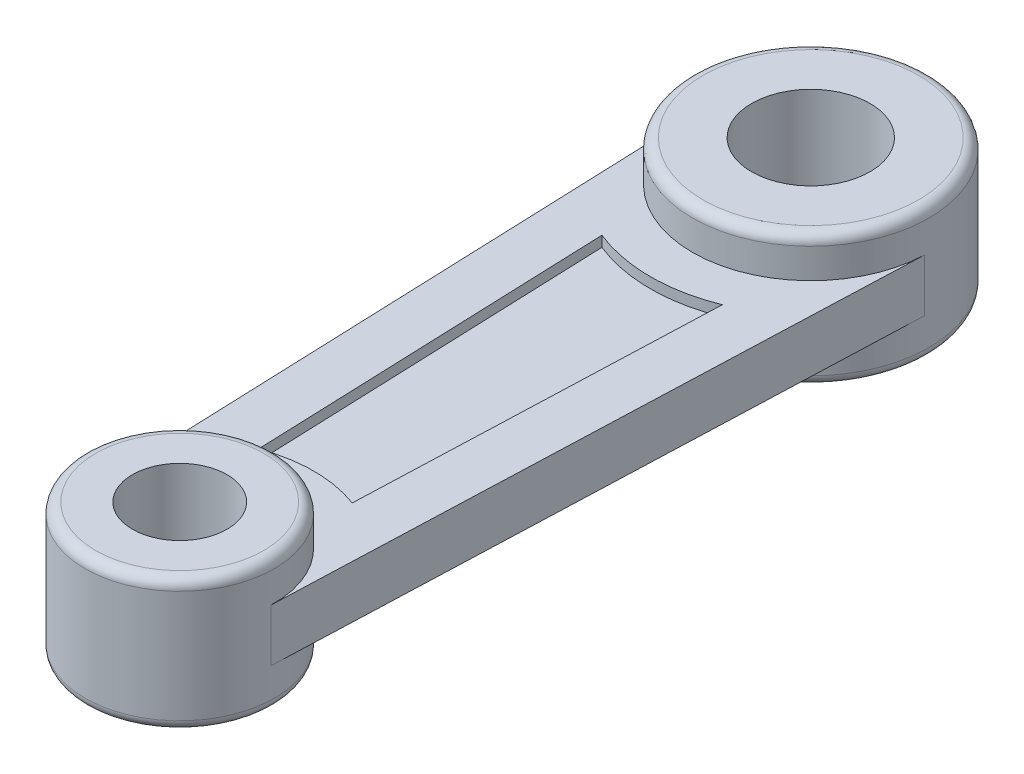
ISO-10303-21;
HEADER;
FILE_DESCRIPTION(('STEP AP214'),'2;1');
FILE_NAME('part.step','',(''),(''),'','','');
FILE_SCHEMA(('AUTOMOTIVE_DESIGN { 1 0 10303 214 1 1 1 1 }'));
ENDSEC;
DATA;
#1=APPLICATION_CONTEXT('core data for automotive mechanical design processes');
#2=APPLICATION_PROTOCOL_DEFINITION('international standard','automotive_design',2000,#1);
#3=PRODUCT_CONTEXT('',#1,'mechanical');
#4=PRODUCT('Part','Part','',(#3));
#5=PRODUCT_RELATED_PRODUCT_CATEGORY('part','',(#4));
#6=PRODUCT_DEFINITION_FORMATION('','',#4);
#7=PRODUCT_DEFINITION_CONTEXT('part definition',#1,'design');
#8=PRODUCT_DEFINITION('design','',#6,#7);
#9=PRODUCT_DEFINITION_SHAPE('','',#8);
#10=(LENGTH_UNIT() NAMED_UNIT(*) SI_UNIT(.MILLI.,.METRE.));
#11=(NAMED_UNIT(*) PLANE_ANGLE_UNIT() SI_UNIT($,.RADIAN.));
#12=(NAMED_UNIT(*) SI_UNIT($,.STERADIAN.) SOLID_ANGLE_UNIT());
#13=UNCERTAINTY_MEASURE_WITH_UNIT(LENGTH_MEASURE(1.E-05),#10,'distance_accuracy_value','');
#14=(GEOMETRIC_REPRESENTATION_CONTEXT(3) GLOBAL_UNCERTAINTY_ASSIGNED_CONTEXT((#13)) GLOBAL_UNIT_ASSIGNED_CONTEXT((#10,
#11,#12)) REPRESENTATION_CONTEXT('',''));
#15=CARTESIAN_POINT('',(0.,0.,0.));
#16=DIRECTION('',(0.,0.,1.));
#17=DIRECTION('',(1.,0.,0.));
#18=AXIS2_PLACEMENT_3D('',#15,#16,#17);
#19=CARTESIAN_POINT('',(0.,31.65,0.));
#20=DIRECTION('',(0.,1.,0.));
#21=DIRECTION('',(0.,0.,1.));
#22=AXIS2_PLACEMENT_3D('',#19,#20,#21);
#23=PLANE('',#22);
#24=CARTESIAN_POINT('',(0.,31.65,0.));
#25=DIRECTION('',(0.,1.,0.));
#26=DIRECTION('',(0.,0.,1.));
#27=AXIS2_PLACEMENT_3D('',#24,#25,#26);
#28=CIRCLE('',#27,40.);
#29=CARTESIAN_POINT('',(0.,31.65,40.));
#30=VERTEX_POINT('',#29);
#31=EDGE_CURVE('E11',#30,#30,#28,.T.);
#32=ORIENTED_EDGE('',*,*,#31,.T.);
#33=EDGE_LOOP('',(#32));
#34=FACE_BOUND('',#33,.T.);
#35=CARTESIAN_POINT('',(0.,31.65,0.));
#36=DIRECTION('',(0.,1.,0.));
#37=DIRECTION('',(0.,0.,1.));
#38=AXIS2_PLACEMENT_3D('',#35,#36,#37);
#39=CIRCLE('',#38,22.5);
#40=CARTESIAN_POINT('',(0.,31.65,22.5));
#41=VERTEX_POINT('',#40);
#42=EDGE_CURVE('E279',#41,#41,#39,.T.);
#43=ORIENTED_EDGE('',*,*,#42,.F.);
#44=EDGE_LOOP('',(#43));
#45=FACE_BOUND('',#44,.T.);
#46=ADVANCED_FACE('F45',(#34,#45),#23,.T.);
#47=CARTESIAN_POINT('',(0.,-31.65,0.));
#48=DIRECTION('',(0.,1.,0.));
#49=DIRECTION('',(0.,0.,1.));
#50=AXIS2_PLACEMENT_3D('',#47,#48,#49);
#51=PLANE('',#50);
#52=CARTESIAN_POINT('',(0.,-31.65,0.));
#53=DIRECTION('',(0.,1.,0.));
#54=DIRECTION('',(0.,0.,1.));
#55=AXIS2_PLACEMENT_3D('',#52,#53,#54);
#56=CIRCLE('',#55,40.);
#57=CARTESIAN_POINT('',(0.,-31.65,40.));
#58=VERTEX_POINT('',#57);
#59=EDGE_CURVE('E54',#58,#58,#56,.F.);
#60=ORIENTED_EDGE('',*,*,#59,.T.);
#61=EDGE_LOOP('',(#60));
#62=FACE_BOUND('',#61,.T.);
#63=CARTESIAN_POINT('',(0.,-31.65,0.));
#64=DIRECTION('',(0.,1.,0.));
#65=DIRECTION('',(0.,0.,1.));
#66=AXIS2_PLACEMENT_3D('',#63,#64,#65);
#67=CIRCLE('',#66,22.5);
#68=CARTESIAN_POINT('',(0.,-31.65,22.5));
#69=VERTEX_POINT('',#68);
#70=EDGE_CURVE('E278',#69,#69,#67,.T.);
#71=ORIENTED_EDGE('',*,*,#70,.T.);
#72=EDGE_LOOP('',(#71));
#73=FACE_BOUND('',#72,.T.);
#74=ADVANCED_FACE('F313',(#62,#73),#51,.F.);
#75=CARTESIAN_POINT('',(0.,31.65,0.));
#76=DIRECTION('',(0.,-1.,0.));
#77=DIRECTION('',(0.,0.,-1.));
#78=AXIS2_PLACEMENT_3D('',#75,#76,#77);
#79=CYLINDRICAL_SURFACE('',#78,45.);
#80=CARTESIAN_POINT('',(0.,-26.65,0.));
#81=DIRECTION('',(0.,1.,0.));
#82=DIRECTION('',(0.,0.,1.));
#83=AXIS2_PLACEMENT_3D('',#80,#81,#82);
#84=CIRCLE('',#83,45.);
#85=CARTESIAN_POINT('',(0.,-26.65,45.));
#86=VERTEX_POINT('',#85);
#87=EDGE_CURVE('E306',#86,#86,#84,.T.);
#88=ORIENTED_EDGE('',*,*,#87,.T.);
#89=EDGE_LOOP('',(#88));
#90=FACE_BOUND('',#89,.T.);
#91=CARTESIAN_POINT('',(0.,26.65,0.));
#92=DIRECTION('',(0.,1.,0.));
#93=DIRECTION('',(0.,0.,1.));
#94=AXIS2_PLACEMENT_3D('',#91,#92,#93);
#95=CIRCLE('',#94,45.);
#96=CARTESIAN_POINT('',(0.,26.65,45.));
#97=VERTEX_POINT('',#96);
#98=EDGE_CURVE('E302',#97,#97,#95,.F.);
#99=ORIENTED_EDGE('',*,*,#98,.T.);
#100=EDGE_LOOP('',(#99));
#101=FACE_BOUND('',#100,.T.);
#102=DIRECTION('',(0.,-1.,0.));
#103=VECTOR('',#102,1.);
#104=CARTESIAN_POINT('',(44.9683482435146,12.5,1.6875));
#105=LINE('',#104,#103);
#106=CARTESIAN_POINT('',(44.9683482435146,12.5,1.6875));
#107=VERTEX_POINT('',#106);
#108=CARTESIAN_POINT('',(44.9683482435146,-12.5,1.6875));
#109=VERTEX_POINT('',#108);
#110=EDGE_CURVE('E274',#107,#109,#105,.T.);
#111=ORIENTED_EDGE('',*,*,#110,.F.);
#112=CARTESIAN_POINT('',(0.,12.5,0.));
#113=DIRECTION('',(0.,-1.,0.));
#114=DIRECTION('',(0.,0.,1.));
#115=AXIS2_PLACEMENT_3D('',#112,#113,#114);
#116=CIRCLE('',#115,45.);
#117=CARTESIAN_POINT('',(-44.9683482435146,12.5,1.6875));
#118=VERTEX_POINT('',#117);
#119=EDGE_CURVE('E236',#118,#107,#116,.T.);
#120=ORIENTED_EDGE('',*,*,#119,.F.);
#121=DIRECTION('',(0.,-1.,0.));
#122=VECTOR('',#121,1.);
#123=CARTESIAN_POINT('',(-44.9683482435146,12.5,1.6875));
#124=LINE('',#123,#122);
#125=CARTESIAN_POINT('',(-44.9683482435146,-12.5,1.6875));
#126=VERTEX_POINT('',#125);
#127=EDGE_CURVE('E251',#118,#126,#124,.T.);
#128=ORIENTED_EDGE('',*,*,#127,.T.);
#129=CARTESIAN_POINT('',(0.,-12.5,0.));
#130=DIRECTION('',(0.,-1.,0.));
#131=DIRECTION('',(0.,0.,1.));
#132=AXIS2_PLACEMENT_3D('',#129,#130,#131);
#133=CIRCLE('',#132,45.);
#134=EDGE_CURVE('E232',#126,#109,#133,.T.);
#135=ORIENTED_EDGE('',*,*,#134,.T.);
#136=EDGE_LOOP('',(#111,#120,#128,#135));
#137=FACE_BOUND('',#136,.T.);
#138=ADVANCED_FACE('F322',(#90,#101,#137),#79,.T.);
#139=CARTESIAN_POINT('',(0.,31.65,0.));
#140=DIRECTION('',(0.,-1.,0.));
#141=DIRECTION('',(0.,0.,-1.));
#142=AXIS2_PLACEMENT_3D('',#139,#140,#141);
#143=CYLINDRICAL_SURFACE('',#142,22.5);
#144=ORIENTED_EDGE('',*,*,#42,.T.);
#145=EDGE_LOOP('',(#144));
#146=FACE_BOUND('',#145,.T.);
#147=ORIENTED_EDGE('',*,*,#70,.F.);
#148=EDGE_LOOP('',(#147));
#149=FACE_BOUND('',#148,.T.);
#150=ADVANCED_FACE('F325',(#146,#149),#143,.F.);
#151=CARTESIAN_POINT('',(56.2104353043932,12.5,-297.890625));
#152=DIRECTION('',(-0.999296627633657,0.,-0.0375));
#153=DIRECTION('',(-0.0375,0.,0.999296627633657));
#154=AXIS2_PLACEMENT_3D('',#151,#152,#153);
#155=PLANE('',#154);
#156=DIRECTION('',(0.0375,0.,-0.999296627633657));
#157=VECTOR('',#156,1.);
#158=CARTESIAN_POINT('',(56.2104353043932,-12.5,-297.890625));
#159=LINE('',#158,#157);
#160=CARTESIAN_POINT('',(56.2104353043932,-12.5,-297.890625));
#161=VERTEX_POINT('',#160);
#162=EDGE_CURVE('E254',#109,#161,#159,.T.);
#163=ORIENTED_EDGE('',*,*,#162,.T.);
#164=DIRECTION('',(0.,-1.,0.));
#165=VECTOR('',#164,1.);
#166=CARTESIAN_POINT('',(56.2104353043932,12.5,-297.890625));
#167=LINE('',#166,#165);
#168=CARTESIAN_POINT('',(56.2104353043932,12.5,-297.890625));
#169=VERTEX_POINT('',#168);
#170=EDGE_CURVE('E270',#169,#161,#167,.T.);
#171=ORIENTED_EDGE('',*,*,#170,.F.);
#172=DIRECTION('',(0.0375,0.,-0.999296627633657));
#173=VECTOR('',#172,1.);
#174=CARTESIAN_POINT('',(56.2104353043932,12.5,-297.890625));
#175=LINE('',#174,#173);
#176=EDGE_CURVE('E240',#107,#169,#175,.T.);
#177=ORIENTED_EDGE('',*,*,#176,.F.);
#178=ORIENTED_EDGE('',*,*,#110,.T.);
#179=EDGE_LOOP('',(#163,#171,#177,#178));
#180=FACE_BOUND('',#179,.T.);
#181=ADVANCED_FACE('F334',(#180),#155,.F.);
#182=CARTESIAN_POINT('',(-56.2104353043932,12.5,-297.890625));
#183=DIRECTION('',(0.999296627633657,0.,-0.0375));
#184=DIRECTION('',(-0.0375,0.,-0.999296627633657));
#185=AXIS2_PLACEMENT_3D('',#182,#183,#184);
#186=PLANE('',#185);
#187=DIRECTION('',(0.0375,0.,0.999296627633657));
#188=VECTOR('',#187,1.);
#189=CARTESIAN_POINT('',(-56.2104353043932,-12.5,-297.890625));
#190=LINE('',#189,#188);
#191=CARTESIAN_POINT('',(-56.2104353043932,-12.5,-297.890625));
#192=VERTEX_POINT('',#191);
#193=EDGE_CURVE('E241',#192,#126,#190,.T.);
#194=ORIENTED_EDGE('',*,*,#193,.T.);
#195=ORIENTED_EDGE('',*,*,#127,.F.);
#196=DIRECTION('',(0.0375,0.,0.999296627633657));
#197=VECTOR('',#196,1.);
#198=CARTESIAN_POINT('',(-56.2104353043932,12.5,-297.890625));
#199=LINE('',#198,#197);
#200=CARTESIAN_POINT('',(-56.2104353043932,12.5,-297.890625));
#201=VERTEX_POINT('',#200);
#202=EDGE_CURVE('E247',#201,#118,#199,.T.);
#203=ORIENTED_EDGE('',*,*,#202,.F.);
#204=DIRECTION('',(0.,-1.,0.));
#205=VECTOR('',#204,1.);
#206=CARTESIAN_POINT('',(-56.2104353043932,12.5,-297.890625));
#207=LINE('',#206,#205);
#208=EDGE_CURVE('E266',#201,#192,#207,.T.);
#209=ORIENTED_EDGE('',*,*,#208,.T.);
#210=EDGE_LOOP('',(#194,#195,#203,#209));
#211=FACE_BOUND('',#210,.T.);
#212=ADVANCED_FACE('F342',(#211),#186,.F.);
#213=CARTESIAN_POINT('',(0.,12.5,0.));
#214=DIRECTION('',(0.,1.,0.));
#215=DIRECTION('',(0.,0.,1.));
#216=AXIS2_PLACEMENT_3D('',#213,#214,#215);
#217=PLANE('',#216);
#218=CARTESIAN_POINT('',(0.,12.5,0.));
#219=DIRECTION('',(0.,-1.,0.));
#220=DIRECTION('',(0.,0.,1.));
#221=AXIS2_PLACEMENT_3D('',#218,#219,#220);
#222=CIRCLE('',#221,63.75);
#223=CARTESIAN_POINT('',(-22.2558638050738,12.5,-59.7389238795779));
#224=VERTEX_POINT('',#223);
#225=CARTESIAN_POINT('',(22.2558638050738,12.5,-59.7389238795779));
#226=VERTEX_POINT('',#225);
#227=EDGE_CURVE('E69',#224,#226,#222,.T.);
#228=ORIENTED_EDGE('',*,*,#227,.F.);
#229=DIRECTION('',(0.0374999999999999,0.,0.999296627633657));
#230=VECTOR('',#229,1.);
#231=CARTESIAN_POINT('',(-28.6198144116936,12.5,-229.324907336175));
#232=LINE('',#231,#230);
#233=CARTESIAN_POINT('',(-28.6198144116936,12.5,-229.324907336175));
#234=VERTEX_POINT('',#233);
#235=EDGE_CURVE('E190',#234,#224,#232,.T.);
#236=ORIENTED_EDGE('',*,*,#235,.F.);
#237=CARTESIAN_POINT('',(0.,12.5,-300.));
#238=DIRECTION('',(0.,-1.,0.));
#239=DIRECTION('',(0.,0.,1.));
#240=AXIS2_PLACEMENT_3D('',#237,#238,#239);
#241=CIRCLE('',#240,76.25);
#242=CARTESIAN_POINT('',(28.6198144116936,12.5,-229.324907336175));
#243=VERTEX_POINT('',#242);
#244=EDGE_CURVE('E209',#243,#234,#241,.T.);
#245=ORIENTED_EDGE('',*,*,#244,.F.);
#246=DIRECTION('',(0.0375,0.,-0.999296627633657));
#247=VECTOR('',#246,1.);
#248=CARTESIAN_POINT('',(22.2558638050738,12.5,-59.7389238795779));
#249=LINE('',#248,#247);
#250=EDGE_CURVE('E205',#226,#243,#249,.T.);
#251=ORIENTED_EDGE('',*,*,#250,.F.);
#252=EDGE_LOOP('',(#228,#236,#245,#251));
#253=FACE_BOUND('',#252,.T.);
#254=ORIENTED_EDGE('',*,*,#119,.T.);
#255=ORIENTED_EDGE('',*,*,#176,.T.);
#256=CARTESIAN_POINT('',(0.,12.5,-300.));
#257=DIRECTION('',(0.,-1.,0.));
#258=DIRECTION('',(0.,0.,1.));
#259=AXIS2_PLACEMENT_3D('',#256,#257,#258);
#260=CIRCLE('',#259,56.25);
#261=EDGE_CURVE('E244',#169,#201,#260,.T.);
#262=ORIENTED_EDGE('',*,*,#261,.T.);
#263=ORIENTED_EDGE('',*,*,#202,.T.);
#264=EDGE_LOOP('',(#254,#255,#262,#263));
#265=FACE_BOUND('',#264,.T.);
#266=ADVANCED_FACE('F337',(#253,#265),#217,.T.);
#267=CARTESIAN_POINT('',(0.,-12.5,0.));
#268=DIRECTION('',(0.,1.,0.));
#269=DIRECTION('',(0.,0.,1.));
#270=AXIS2_PLACEMENT_3D('',#267,#268,#269);
#271=PLANE('',#270);
#272=DIRECTION('',(-0.0374999999999999,0.,-0.999296627633657));
#273=VECTOR('',#272,1.);
#274=CARTESIAN_POINT('',(-28.6198144116936,-12.5,-229.324907336175));
#275=LINE('',#274,#273);
#276=CARTESIAN_POINT('',(-22.2558638050738,-12.5,-59.7389238795779));
#277=VERTEX_POINT('',#276);
#278=CARTESIAN_POINT('',(-28.6198144116936,-12.5,-229.324907336175));
#279=VERTEX_POINT('',#278);
#280=EDGE_CURVE('E171',#277,#279,#275,.T.);
#281=ORIENTED_EDGE('',*,*,#280,.F.);
#282=CARTESIAN_POINT('',(0.,-12.5,0.));
#283=DIRECTION('',(0.,1.,0.));
#284=DIRECTION('',(0.,0.,-1.));
#285=AXIS2_PLACEMENT_3D('',#282,#283,#284);
#286=CIRCLE('',#285,63.75);
#287=CARTESIAN_POINT('',(22.2558638050738,-12.5,-59.7389238795779));
#288=VERTEX_POINT('',#287);
#289=EDGE_CURVE('E61',#288,#277,#286,.T.);
#290=ORIENTED_EDGE('',*,*,#289,.F.);
#291=DIRECTION('',(-0.0374999999999999,0.,0.999296627633657));
#292=VECTOR('',#291,1.);
#293=CARTESIAN_POINT('',(22.2558638050738,-12.5,-59.7389238795779));
#294=LINE('',#293,#292);
#295=CARTESIAN_POINT('',(28.6198144116936,-12.5,-229.324907336175));
#296=VERTEX_POINT('',#295);
#297=EDGE_CURVE('E158',#296,#288,#294,.T.);
#298=ORIENTED_EDGE('',*,*,#297,.F.);
#299=CARTESIAN_POINT('',(0.,-12.5,-300.));
#300=DIRECTION('',(0.,1.,0.));
#301=DIRECTION('',(0.,0.,-1.));
#302=AXIS2_PLACEMENT_3D('',#299,#300,#301);
#303=CIRCLE('',#302,76.25);
#304=EDGE_CURVE('E162',#279,#296,#303,.T.);
#305=ORIENTED_EDGE('',*,*,#304,.F.);
#306=EDGE_LOOP('',(#281,#290,#298,#305));
#307=FACE_BOUND('',#306,.T.);
#308=ORIENTED_EDGE('',*,*,#134,.F.);
#309=ORIENTED_EDGE('',*,*,#193,.F.);
#310=CARTESIAN_POINT('',(0.,-12.5,-300.));
#311=DIRECTION('',(0.,-1.,0.));
#312=DIRECTION('',(0.,0.,1.));
#313=AXIS2_PLACEMENT_3D('',#310,#311,#312);
#314=CIRCLE('',#313,56.25);
#315=EDGE_CURVE('E257',#161,#192,#314,.T.);
#316=ORIENTED_EDGE('',*,*,#315,.F.);
#317=ORIENTED_EDGE('',*,*,#162,.F.);
#318=EDGE_LOOP('',(#308,#309,#316,#317));
#319=FACE_BOUND('',#318,.T.);
#320=ADVANCED_FACE('F345',(#307,#319),#271,.F.);
#321=CARTESIAN_POINT('',(0.,31.65,-300.));
#322=DIRECTION('',(0.,1.,0.));
#323=DIRECTION('',(0.,0.,1.));
#324=AXIS2_PLACEMENT_3D('',#321,#322,#323);
#325=PLANE('',#324);
#326=CARTESIAN_POINT('',(0.,31.65,-300.));
#327=DIRECTION('',(0.,1.,0.));
#328=DIRECTION('',(0.,0.,1.));
#329=AXIS2_PLACEMENT_3D('',#326,#327,#328);
#330=CIRCLE('',#329,51.25);
#331=CARTESIAN_POINT('',(0.,31.65,-248.75));
#332=VERTEX_POINT('',#331);
#333=EDGE_CURVE('E298',#332,#332,#330,.T.);
#334=ORIENTED_EDGE('',*,*,#333,.T.);
#335=EDGE_LOOP('',(#334));
#336=FACE_BOUND('',#335,.T.);
#337=CARTESIAN_POINT('',(0.,31.65,-300.));
#338=DIRECTION('',(0.,1.,0.));
#339=DIRECTION('',(0.,0.,1.));
#340=AXIS2_PLACEMENT_3D('',#337,#338,#339);
#341=CIRCLE('',#340,28.15);
#342=CARTESIAN_POINT('',(0.,31.65,-271.85));
#343=VERTEX_POINT('',#342);
#344=EDGE_CURVE('E219',#343,#343,#341,.T.);
#345=ORIENTED_EDGE('',*,*,#344,.F.);
#346=EDGE_LOOP('',(#345));
#347=FACE_BOUND('',#346,.T.);
#348=ADVANCED_FACE('F361',(#336,#347),#325,.T.);
#349=CARTESIAN_POINT('',(0.,-31.65,-300.));
#350=DIRECTION('',(0.,1.,0.));
#351=DIRECTION('',(0.,0.,1.));
#352=AXIS2_PLACEMENT_3D('',#349,#350,#351);
#353=PLANE('',#352);
#354=CARTESIAN_POINT('',(0.,-31.65,-300.));
#355=DIRECTION('',(0.,1.,0.));
#356=DIRECTION('',(0.,0.,1.));
#357=AXIS2_PLACEMENT_3D('',#354,#355,#356);
#358=CIRCLE('',#357,51.25);
#359=CARTESIAN_POINT('',(0.,-31.65,-248.75));
#360=VERTEX_POINT('',#359);
#361=EDGE_CURVE('E294',#360,#360,#358,.F.);
#362=ORIENTED_EDGE('',*,*,#361,.T.);
#363=EDGE_LOOP('',(#362));
#364=FACE_BOUND('',#363,.T.);
#365=CARTESIAN_POINT('',(0.,-31.65,-300.));
#366=DIRECTION('',(0.,1.,0.));
#367=DIRECTION('',(0.,0.,1.));
#368=AXIS2_PLACEMENT_3D('',#365,#366,#367);
#369=CIRCLE('',#368,28.15);
#370=CARTESIAN_POINT('',(0.,-31.65,-271.85));
#371=VERTEX_POINT('',#370);
#372=EDGE_CURVE('E228',#371,#371,#369,.T.);
#373=ORIENTED_EDGE('',*,*,#372,.T.);
#374=EDGE_LOOP('',(#373));
#375=FACE_BOUND('',#374,.T.);
#376=ADVANCED_FACE('F350',(#364,#375),#353,.F.);
#377=CARTESIAN_POINT('',(0.,31.65,-300.));
#378=DIRECTION('',(0.,-1.,0.));
#379=DIRECTION('',(0.,0.,-1.));
#380=AXIS2_PLACEMENT_3D('',#377,#378,#379);
#381=CYLINDRICAL_SURFACE('',#380,56.25);
#382=CARTESIAN_POINT('',(0.,-26.65,-300.));
#383=DIRECTION('',(0.,1.,0.));
#384=DIRECTION('',(0.,0.,1.));
#385=AXIS2_PLACEMENT_3D('',#382,#383,#384);
#386=CIRCLE('',#385,56.25);
#387=CARTESIAN_POINT('',(0.,-26.65,-243.75));
#388=VERTEX_POINT('',#387);
#389=EDGE_CURVE('E290',#388,#388,#386,.T.);
#390=ORIENTED_EDGE('',*,*,#389,.T.);
#391=EDGE_LOOP('',(#390));
#392=FACE_BOUND('',#391,.T.);
#393=CARTESIAN_POINT('',(0.,26.65,-300.));
#394=DIRECTION('',(0.,1.,0.));
#395=DIRECTION('',(0.,0.,1.));
#396=AXIS2_PLACEMENT_3D('',#393,#394,#395);
#397=CIRCLE('',#396,56.25);
#398=CARTESIAN_POINT('',(0.,26.65,-243.75));
#399=VERTEX_POINT('',#398);
#400=EDGE_CURVE('E283',#399,#399,#397,.F.);
#401=ORIENTED_EDGE('',*,*,#400,.T.);
#402=EDGE_LOOP('',(#401));
#403=FACE_BOUND('',#402,.T.);
#404=ORIENTED_EDGE('',*,*,#261,.F.);
#405=ORIENTED_EDGE('',*,*,#170,.T.);
#406=ORIENTED_EDGE('',*,*,#315,.T.);
#407=ORIENTED_EDGE('',*,*,#208,.F.);
#408=EDGE_LOOP('',(#404,#405,#406,#407));
#409=FACE_BOUND('',#408,.T.);
#410=ADVANCED_FACE('F347',(#392,#403,#409),#381,.T.);
#411=CARTESIAN_POINT('',(0.,31.65,-300.));
#412=DIRECTION('',(0.,-1.,0.));
#413=DIRECTION('',(0.,0.,-1.));
#414=AXIS2_PLACEMENT_3D('',#411,#412,#413);
#415=CYLINDRICAL_SURFACE('',#414,28.15);
#416=ORIENTED_EDGE('',*,*,#344,.T.);
#417=EDGE_LOOP('',(#416));
#418=FACE_BOUND('',#417,.T.);
#419=ORIENTED_EDGE('',*,*,#372,.F.);
#420=EDGE_LOOP('',(#419));
#421=FACE_BOUND('',#420,.T.);
#422=ADVANCED_FACE('F349',(#418,#421),#415,.F.);
#423=CARTESIAN_POINT('',(0.,7.5,0.));
#424=DIRECTION('',(0.,1.,0.));
#425=DIRECTION('',(0.,0.,1.));
#426=AXIS2_PLACEMENT_3D('',#423,#424,#425);
#427=CYLINDRICAL_SURFACE('',#426,63.75);
#428=ORIENTED_EDGE('',*,*,#227,.T.);
#429=DIRECTION('',(0.,1.,0.));
#430=VECTOR('',#429,1.);
#431=CARTESIAN_POINT('',(22.2558638050738,7.5,-59.7389238795779));
#432=LINE('',#431,#430);
#433=CARTESIAN_POINT('',(22.2558638050738,7.5,-59.7389238795779));
#434=VERTEX_POINT('',#433);
#435=EDGE_CURVE('E202',#434,#226,#432,.T.);
#436=ORIENTED_EDGE('',*,*,#435,.F.);
#437=CARTESIAN_POINT('',(0.,7.5,0.));
#438=DIRECTION('',(0.,-1.,0.));
#439=DIRECTION('',(0.,0.,1.));
#440=AXIS2_PLACEMENT_3D('',#437,#438,#439);
#441=CIRCLE('',#440,63.75);
#442=CARTESIAN_POINT('',(-22.2558638050738,7.5,-59.7389238795779));
#443=VERTEX_POINT('',#442);
#444=EDGE_CURVE('E185',#443,#434,#441,.T.);
#445=ORIENTED_EDGE('',*,*,#444,.F.);
#446=DIRECTION('',(0.,1.,0.));
#447=VECTOR('',#446,1.);
#448=CARTESIAN_POINT('',(-22.2558638050738,7.5,-59.7389238795779));
#449=LINE('',#448,#447);
#450=EDGE_CURVE('E216',#443,#224,#449,.T.);
#451=ORIENTED_EDGE('',*,*,#450,.T.);
#452=EDGE_LOOP('',(#428,#436,#445,#451));
#453=FACE_BOUND('',#452,.T.);
#454=ADVANCED_FACE('F358',(#453),#427,.T.);
#455=CARTESIAN_POINT('',(-28.6198144116936,7.5,-229.324907336175));
#456=DIRECTION('',(-0.999296627633657,0.,0.0374999999999999));
#457=DIRECTION('',(0.0374999999999999,0.,0.999296627633657));
#458=AXIS2_PLACEMENT_3D('',#455,#456,#457);
#459=PLANE('',#458);
#460=ORIENTED_EDGE('',*,*,#235,.T.);
#461=ORIENTED_EDGE('',*,*,#450,.F.);
#462=DIRECTION('',(0.0374999999999999,0.,0.999296627633657));
#463=VECTOR('',#462,1.);
#464=CARTESIAN_POINT('',(-28.6198144116936,7.5,-229.324907336175));
#465=LINE('',#464,#463);
#466=CARTESIAN_POINT('',(-28.6198144116936,7.5,-229.324907336175));
#467=VERTEX_POINT('',#466);
#468=EDGE_CURVE('E198',#467,#443,#465,.T.);
#469=ORIENTED_EDGE('',*,*,#468,.F.);
#470=DIRECTION('',(0.,1.,0.));
#471=VECTOR('',#470,1.);
#472=CARTESIAN_POINT('',(-28.6198144116936,7.5,-229.324907336175));
#473=LINE('',#472,#471);
#474=EDGE_CURVE('E220',#467,#234,#473,.T.);
#475=ORIENTED_EDGE('',*,*,#474,.T.);
#476=EDGE_LOOP('',(#460,#461,#469,#475));
#477=FACE_BOUND('',#476,.T.);
#478=ADVANCED_FACE('F473',(#477),#459,.F.);
#479=CARTESIAN_POINT('',(0.,7.5,-300.));
#480=DIRECTION('',(0.,1.,0.));
#481=DIRECTION('',(0.,0.,1.));
#482=AXIS2_PLACEMENT_3D('',#479,#480,#481);
#483=CYLINDRICAL_SURFACE('',#482,76.25);
#484=ORIENTED_EDGE('',*,*,#244,.T.);
#485=ORIENTED_EDGE('',*,*,#474,.F.);
#486=CARTESIAN_POINT('',(0.,7.5,-300.));
#487=DIRECTION('',(0.,-1.,0.));
#488=DIRECTION('',(0.,0.,1.));
#489=AXIS2_PLACEMENT_3D('',#486,#487,#488);
#490=CIRCLE('',#489,76.25);
#491=CARTESIAN_POINT('',(28.6198144116936,7.5,-229.324907336175));
#492=VERTEX_POINT('',#491);
#493=EDGE_CURVE('E194',#492,#467,#490,.T.);
#494=ORIENTED_EDGE('',*,*,#493,.F.);
#495=DIRECTION('',(0.,1.,0.));
#496=VECTOR('',#495,1.);
#497=CARTESIAN_POINT('',(28.6198144116936,7.5,-229.324907336175));
#498=LINE('',#497,#496);
#499=EDGE_CURVE('E223',#492,#243,#498,.T.);
#500=ORIENTED_EDGE('',*,*,#499,.T.);
#501=EDGE_LOOP('',(#484,#485,#494,#500));
#502=FACE_BOUND('',#501,.T.);
#503=ADVANCED_FACE('F481',(#502),#483,.T.);
#504=CARTESIAN_POINT('',(22.2558638050738,7.5,-59.7389238795779));
#505=DIRECTION('',(0.999296627633657,0.,0.0375));
#506=DIRECTION('',(0.0375,0.,-0.999296627633657));
#507=AXIS2_PLACEMENT_3D('',#504,#505,#506);
#508=PLANE('',#507);
#509=ORIENTED_EDGE('',*,*,#250,.T.);
#510=ORIENTED_EDGE('',*,*,#499,.F.);
#511=DIRECTION('',(0.0375,0.,-0.999296627633657));
#512=VECTOR('',#511,1.);
#513=CARTESIAN_POINT('',(22.2558638050738,7.5,-59.7389238795779));
#514=LINE('',#513,#512);
#515=EDGE_CURVE('E189',#434,#492,#514,.T.);
#516=ORIENTED_EDGE('',*,*,#515,.F.);
#517=ORIENTED_EDGE('',*,*,#435,.T.);
#518=EDGE_LOOP('',(#509,#510,#516,#517));
#519=FACE_BOUND('',#518,.T.);
#520=ADVANCED_FACE('F491',(#519),#508,.F.);
#521=CARTESIAN_POINT('',(0.,7.5,0.));
#522=DIRECTION('',(0.,1.,0.));
#523=DIRECTION('',(0.,0.,1.));
#524=AXIS2_PLACEMENT_3D('',#521,#522,#523);
#525=PLANE('',#524);
#526=ORIENTED_EDGE('',*,*,#444,.T.);
#527=ORIENTED_EDGE('',*,*,#515,.T.);
#528=ORIENTED_EDGE('',*,*,#493,.T.);
#529=ORIENTED_EDGE('',*,*,#468,.T.);
#530=EDGE_LOOP('',(#526,#527,#528,#529));
#531=FACE_BOUND('',#530,.T.);
#532=ADVANCED_FACE('F501',(#531),#525,.T.);
#533=CARTESIAN_POINT('',(0.,-7.5,0.));
#534=DIRECTION('',(0.,-1.,0.));
#535=DIRECTION('',(0.,0.,-1.));
#536=AXIS2_PLACEMENT_3D('',#533,#534,#535);
#537=CYLINDRICAL_SURFACE('',#536,63.75);
#538=ORIENTED_EDGE('',*,*,#289,.T.);
#539=DIRECTION('',(0.,-1.,0.));
#540=VECTOR('',#539,1.);
#541=CARTESIAN_POINT('',(-22.2558638050738,-7.5,-59.7389238795779));
#542=LINE('',#541,#540);
#543=CARTESIAN_POINT('',(-22.2558638050738,-7.5,-59.7389238795779));
#544=VERTEX_POINT('',#543);
#545=EDGE_CURVE('E133',#544,#277,#542,.T.);
#546=ORIENTED_EDGE('',*,*,#545,.F.);
#547=CARTESIAN_POINT('',(0.,-7.5,0.));
#548=DIRECTION('',(0.,1.,0.));
#549=DIRECTION('',(0.,0.,-1.));
#550=AXIS2_PLACEMENT_3D('',#547,#548,#549);
#551=CIRCLE('',#550,63.75);
#552=CARTESIAN_POINT('',(22.2558638050738,-7.5,-59.7389238795779));
#553=VERTEX_POINT('',#552);
#554=EDGE_CURVE('E137',#553,#544,#551,.T.);
#555=ORIENTED_EDGE('',*,*,#554,.F.);
#556=DIRECTION('',(0.,-1.,0.));
#557=VECTOR('',#556,1.);
#558=CARTESIAN_POINT('',(22.2558638050738,-7.5,-59.7389238795779));
#559=LINE('',#558,#557);
#560=EDGE_CURVE('E177',#553,#288,#559,.T.);
#561=ORIENTED_EDGE('',*,*,#560,.T.);
#562=EDGE_LOOP('',(#538,#546,#555,#561));
#563=FACE_BOUND('',#562,.T.);
#564=ADVANCED_FACE('F135',(#563),#537,.T.);
#565=CARTESIAN_POINT('',(22.2558638050738,-7.5,-59.7389238795779));
#566=DIRECTION('',(0.999296627633657,0.,0.0374999999999999));
#567=DIRECTION('',(0.0374999999999999,0.,-0.999296627633657));
#568=AXIS2_PLACEMENT_3D('',#565,#566,#567);
#569=PLANE('',#568);
#570=ORIENTED_EDGE('',*,*,#297,.T.);
#571=ORIENTED_EDGE('',*,*,#560,.F.);
#572=DIRECTION('',(-0.0374999999999999,0.,0.999296627633657));
#573=VECTOR('',#572,1.);
#574=CARTESIAN_POINT('',(22.2558638050738,-7.5,-59.7389238795779));
#575=LINE('',#574,#573);
#576=CARTESIAN_POINT('',(28.6198144116936,-7.5,-229.324907336175));
#577=VERTEX_POINT('',#576);
#578=EDGE_CURVE('E144',#577,#553,#575,.T.);
#579=ORIENTED_EDGE('',*,*,#578,.F.);
#580=DIRECTION('',(0.,-1.,0.));
#581=VECTOR('',#580,1.);
#582=CARTESIAN_POINT('',(28.6198144116936,-7.5,-229.324907336175));
#583=LINE('',#582,#581);
#584=EDGE_CURVE('E180',#577,#296,#583,.T.);
#585=ORIENTED_EDGE('',*,*,#584,.T.);
#586=EDGE_LOOP('',(#570,#571,#579,#585));
#587=FACE_BOUND('',#586,.T.);
#588=ADVANCED_FACE('F518',(#587),#569,.F.);
#589=CARTESIAN_POINT('',(0.,-7.5,-300.));
#590=DIRECTION('',(0.,-1.,0.));
#591=DIRECTION('',(0.,0.,-1.));
#592=AXIS2_PLACEMENT_3D('',#589,#590,#591);
#593=CYLINDRICAL_SURFACE('',#592,76.25);
#594=ORIENTED_EDGE('',*,*,#304,.T.);
#595=ORIENTED_EDGE('',*,*,#584,.F.);
#596=CARTESIAN_POINT('',(0.,-7.5,-300.));
#597=DIRECTION('',(0.,1.,0.));
#598=DIRECTION('',(0.,0.,-1.));
#599=AXIS2_PLACEMENT_3D('',#596,#597,#598);
#600=CIRCLE('',#599,76.25);
#601=CARTESIAN_POINT('',(-28.6198144116936,-7.5,-229.324907336175));
#602=VERTEX_POINT('',#601);
#603=EDGE_CURVE('E153',#602,#577,#600,.T.);
#604=ORIENTED_EDGE('',*,*,#603,.F.);
#605=DIRECTION('',(0.,-1.,0.));
#606=VECTOR('',#605,1.);
#607=CARTESIAN_POINT('',(-28.6198144116936,-7.5,-229.324907336175));
#608=LINE('',#607,#606);
#609=EDGE_CURVE('E143',#602,#279,#608,.T.);
#610=ORIENTED_EDGE('',*,*,#609,.T.);
#611=EDGE_LOOP('',(#594,#595,#604,#610));
#612=FACE_BOUND('',#611,.T.);
#613=ADVANCED_FACE('F527',(#612),#593,.T.);
#614=CARTESIAN_POINT('',(-28.6198144116936,-7.5,-229.324907336175));
#615=DIRECTION('',(-0.999296627633657,0.,0.0374999999999999));
#616=DIRECTION('',(0.0374999999999999,0.,0.999296627633657));
#617=AXIS2_PLACEMENT_3D('',#614,#615,#616);
#618=PLANE('',#617);
#619=ORIENTED_EDGE('',*,*,#280,.T.);
#620=ORIENTED_EDGE('',*,*,#609,.F.);
#621=DIRECTION('',(-0.0374999999999999,0.,-0.999296627633657));
#622=VECTOR('',#621,1.);
#623=CARTESIAN_POINT('',(-28.6198144116936,-7.5,-229.324907336175));
#624=LINE('',#623,#622);
#625=EDGE_CURVE('E147',#544,#602,#624,.T.);
#626=ORIENTED_EDGE('',*,*,#625,.F.);
#627=ORIENTED_EDGE('',*,*,#545,.T.);
#628=EDGE_LOOP('',(#619,#620,#626,#627));
#629=FACE_BOUND('',#628,.T.);
#630=ADVANCED_FACE('F148',(#629),#618,.F.);
#631=CARTESIAN_POINT('',(0.,-7.5,0.));
#632=DIRECTION('',(0.,-1.,0.));
#633=DIRECTION('',(0.,0.,-1.));
#634=AXIS2_PLACEMENT_3D('',#631,#632,#633);
#635=PLANE('',#634);
#636=ORIENTED_EDGE('',*,*,#554,.T.);
#637=ORIENTED_EDGE('',*,*,#625,.T.);
#638=ORIENTED_EDGE('',*,*,#603,.T.);
#639=ORIENTED_EDGE('',*,*,#578,.T.);
#640=EDGE_LOOP('',(#636,#637,#638,#639));
#641=FACE_BOUND('',#640,.T.);
#642=ADVANCED_FACE('F155',(#641),#635,.T.);
#643=CARTESIAN_POINT('',(0.,-26.65,-300.));
#644=DIRECTION('',(0.,1.,0.));
#645=DIRECTION('',(0.,0.,1.));
#646=AXIS2_PLACEMENT_3D('',#643,#644,#645);
#647=TOROIDAL_SURFACE('',#646,51.25,5.);
#648=ORIENTED_EDGE('',*,*,#361,.F.);
#649=EDGE_LOOP('',(#648));
#650=FACE_BOUND('',#649,.T.);
#651=ORIENTED_EDGE('',*,*,#389,.F.);
#652=EDGE_LOOP('',(#651));
#653=FACE_BOUND('',#652,.T.);
#654=ADVANCED_FACE('F378',(#650,#653),#647,.T.);
#655=CARTESIAN_POINT('',(0.,26.65,-300.));
#656=DIRECTION('',(0.,1.,0.));
#657=DIRECTION('',(0.,0.,1.));
#658=AXIS2_PLACEMENT_3D('',#655,#656,#657);
#659=TOROIDAL_SURFACE('',#658,51.25,5.);
#660=ORIENTED_EDGE('',*,*,#400,.F.);
#661=EDGE_LOOP('',(#660));
#662=FACE_BOUND('',#661,.T.);
#663=ORIENTED_EDGE('',*,*,#333,.F.);
#664=EDGE_LOOP('',(#663));
#665=FACE_BOUND('',#664,.T.);
#666=ADVANCED_FACE('F319',(#662,#665),#659,.T.);
#667=CARTESIAN_POINT('',(0.,-26.65,0.));
#668=DIRECTION('',(0.,1.,0.));
#669=DIRECTION('',(0.,0.,1.));
#670=AXIS2_PLACEMENT_3D('',#667,#668,#669);
#671=TOROIDAL_SURFACE('',#670,40.,5.);
#672=ORIENTED_EDGE('',*,*,#59,.F.);
#673=EDGE_LOOP('',(#672));
#674=FACE_BOUND('',#673,.T.);
#675=ORIENTED_EDGE('',*,*,#87,.F.);
#676=EDGE_LOOP('',(#675));
#677=FACE_BOUND('',#676,.T.);
#678=ADVANCED_FACE('F316',(#674,#677),#671,.T.);
#679=CARTESIAN_POINT('',(0.,26.65,0.));
#680=DIRECTION('',(0.,1.,0.));
#681=DIRECTION('',(0.,0.,1.));
#682=AXIS2_PLACEMENT_3D('',#679,#680,#681);
#683=TOROIDAL_SURFACE('',#682,40.,5.);
#684=ORIENTED_EDGE('',*,*,#98,.F.);
#685=EDGE_LOOP('',(#684));
#686=FACE_BOUND('',#685,.T.);
#687=ORIENTED_EDGE('',*,*,#31,.F.);
#688=EDGE_LOOP('',(#687));
#689=FACE_BOUND('',#688,.T.);
#690=ADVANCED_FACE('F47',(#686,#689),#683,.T.);
#691=CLOSED_SHELL('',(#46,#74,#138,#150,#181,#212,#266,#320,#348,#376,#410,#422,#454,#478,#503,
#520,#532,#564,#588,#613,#630,#642,#654,#666,#678,#690));
#692=MANIFOLD_SOLID_BREP('B2',#691);
#693=ADVANCED_BREP_SHAPE_REPRESENTATION('',(#18,#692),#14);
#694=SHAPE_DEFINITION_REPRESENTATION(#9,#693);
ENDSEC;
END-ISO-10303-21;
